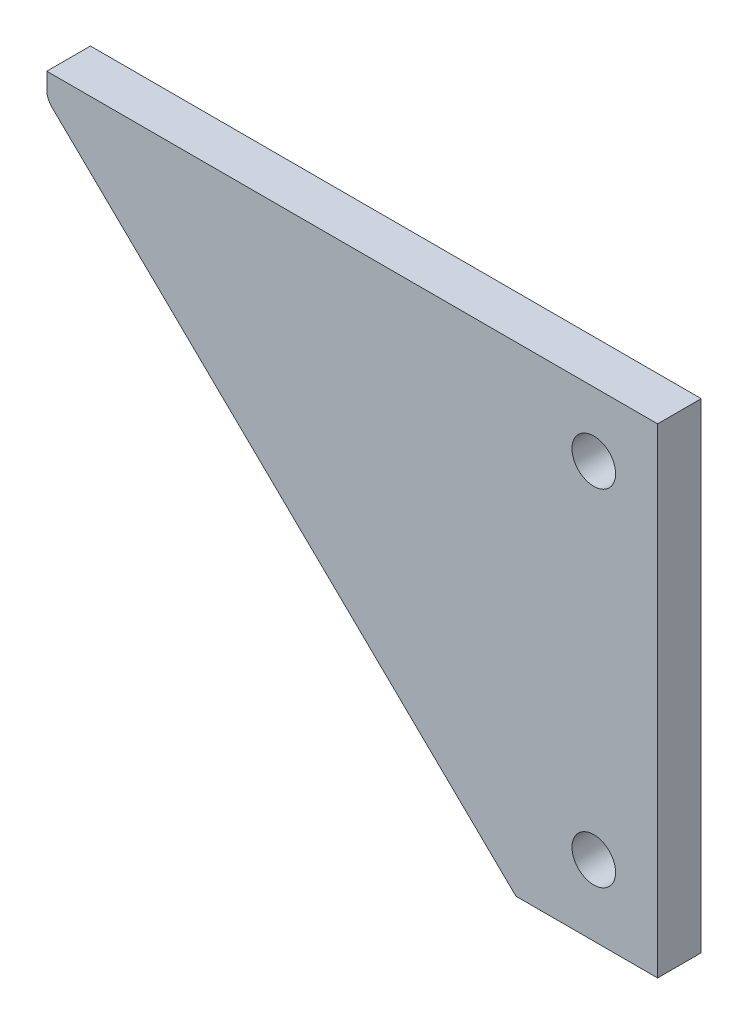
ISO-10303-21;
HEADER;
FILE_DESCRIPTION(('STEP AP214'),'2;1');
FILE_NAME('part.step','',(''),(''),'','','');
FILE_SCHEMA(('AUTOMOTIVE_DESIGN { 1 0 10303 214 1 1 1 1 }'));
ENDSEC;
DATA;
#1=APPLICATION_CONTEXT('core data for automotive mechanical design processes');
#2=APPLICATION_PROTOCOL_DEFINITION('international standard','automotive_design',2000,#1);
#3=PRODUCT_CONTEXT('',#1,'mechanical');
#4=PRODUCT('Part','Part','',(#3));
#5=PRODUCT_RELATED_PRODUCT_CATEGORY('part','',(#4));
#6=PRODUCT_DEFINITION_FORMATION('','',#4);
#7=PRODUCT_DEFINITION_CONTEXT('part definition',#1,'design');
#8=PRODUCT_DEFINITION('design','',#6,#7);
#9=PRODUCT_DEFINITION_SHAPE('','',#8);
#10=(LENGTH_UNIT() NAMED_UNIT(*) SI_UNIT(.MILLI.,.METRE.));
#11=(NAMED_UNIT(*) PLANE_ANGLE_UNIT() SI_UNIT($,.RADIAN.));
#12=(NAMED_UNIT(*) SI_UNIT($,.STERADIAN.) SOLID_ANGLE_UNIT());
#13=UNCERTAINTY_MEASURE_WITH_UNIT(LENGTH_MEASURE(1.E-05),#10,'distance_accuracy_value','');
#14=(GEOMETRIC_REPRESENTATION_CONTEXT(3) GLOBAL_UNCERTAINTY_ASSIGNED_CONTEXT((#13)) GLOBAL_UNIT_ASSIGNED_CONTEXT((#10,
#11,#12)) REPRESENTATION_CONTEXT('',''));
#15=CARTESIAN_POINT('',(0.,0.,0.));
#16=DIRECTION('',(0.,0.,1.));
#17=DIRECTION('',(1.,0.,0.));
#18=AXIS2_PLACEMENT_3D('',#15,#16,#17);
#19=CARTESIAN_POINT('',(0.,0.,5.));
#20=DIRECTION('',(0.,0.,-1.));
#21=DIRECTION('',(-1.,0.,0.));
#22=AXIS2_PLACEMENT_3D('',#19,#20,#21);
#23=PLANE('',#22);
#24=DIRECTION('',(0.,-1.,0.));
#25=VECTOR('',#24,1.);
#26=CARTESIAN_POINT('',(-39.7518732378615,24.6899224806202,5.));
#27=LINE('',#26,#25);
#28=CARTESIAN_POINT('',(-39.7518732378615,27.4031007751938,5.));
#29=VERTEX_POINT('',#28);
#30=CARTESIAN_POINT('',(-39.7518732378615,25.5347678527454,5.));
#31=VERTEX_POINT('',#30);
#32=EDGE_CURVE('E103',#29,#31,#27,.T.);
#33=ORIENTED_EDGE('',*,*,#32,.T.);
#34=CARTESIAN_POINT('',(-37.7518732378615,25.5347678527454,5.));
#35=DIRECTION('',(0.,0.,-1.));
#36=DIRECTION('',(-1.,0.,0.));
#37=AXIS2_PLACEMENT_3D('',#34,#35,#36);
#38=CIRCLE('',#37,2.);
#39=CARTESIAN_POINT('',(-39.1461884833396,24.1009320894073,5.));
#40=VERTEX_POINT('',#39);
#41=EDGE_CURVE('E11',#31,#40,#38,.F.);
#42=ORIENTED_EDGE('',*,*,#41,.T.);
#43=DIRECTION('',(0.71691788166908,-0.697157622739018,0.));
#44=VECTOR('',#43,1.);
#45=CARTESIAN_POINT('',(14.0169678873195,-27.5968992248062,5.));
#46=LINE('',#45,#44);
#47=CARTESIAN_POINT('',(14.0169678873195,-27.5968992248062,5.));
#48=VERTEX_POINT('',#47);
#49=EDGE_CURVE('E92',#40,#48,#46,.T.);
#50=ORIENTED_EDGE('',*,*,#49,.T.);
#51=DIRECTION('',(1.,0.,0.));
#52=VECTOR('',#51,1.);
#53=CARTESIAN_POINT('',(30.2481267621385,-27.5968992248062,5.));
#54=LINE('',#53,#52);
#55=CARTESIAN_POINT('',(30.2481267621385,-27.5968992248062,5.));
#56=VERTEX_POINT('',#55);
#57=EDGE_CURVE('E96',#48,#56,#54,.T.);
#58=ORIENTED_EDGE('',*,*,#57,.T.);
#59=DIRECTION('',(0.,1.,0.));
#60=VECTOR('',#59,1.);
#61=CARTESIAN_POINT('',(30.2481267621385,27.4031007751938,5.));
#62=LINE('',#61,#60);
#63=CARTESIAN_POINT('',(30.2481267621385,27.4031007751938,5.));
#64=VERTEX_POINT('',#63);
#65=EDGE_CURVE('E119',#56,#64,#62,.T.);
#66=ORIENTED_EDGE('',*,*,#65,.T.);
#67=DIRECTION('',(-1.,0.,0.));
#68=VECTOR('',#67,1.);
#69=CARTESIAN_POINT('',(-39.7518732378615,27.4031007751938,5.));
#70=LINE('',#69,#68);
#71=EDGE_CURVE('E122',#64,#29,#70,.T.);
#72=ORIENTED_EDGE('',*,*,#71,.T.);
#73=EDGE_LOOP('',(#33,#42,#50,#58,#66,#72));
#74=FACE_BOUND('',#73,.T.);
#75=CARTESIAN_POINT('',(22.9362631835806,20.0452561597916,5.));
#76=DIRECTION('',(0.,0.,1.));
#77=DIRECTION('',(1.,0.,0.));
#78=AXIS2_PLACEMENT_3D('',#75,#76,#77);
#79=CIRCLE('',#78,2.5);
#80=CARTESIAN_POINT('',(25.4362631835806,20.0452561597916,5.));
#81=VERTEX_POINT('',#80);
#82=EDGE_CURVE('E132',#81,#81,#79,.T.);
#83=ORIENTED_EDGE('',*,*,#82,.F.);
#84=EDGE_LOOP('',(#83));
#85=FACE_BOUND('',#84,.T.);
#86=CARTESIAN_POINT('',(22.9362631835806,-19.5196108443949,5.));
#87=DIRECTION('',(0.,0.,1.));
#88=DIRECTION('',(1.,0.,0.));
#89=AXIS2_PLACEMENT_3D('',#86,#87,#88);
#90=CIRCLE('',#89,2.5);
#91=CARTESIAN_POINT('',(25.4362631835806,-19.5196108443949,5.));
#92=VERTEX_POINT('',#91);
#93=EDGE_CURVE('E176',#92,#92,#90,.T.);
#94=ORIENTED_EDGE('',*,*,#93,.F.);
#95=EDGE_LOOP('',(#94));
#96=FACE_BOUND('',#95,.T.);
#97=ADVANCED_FACE('F39',(#74,#85,#96),#23,.F.);
#98=CARTESIAN_POINT('',(0.,0.,0.));
#99=DIRECTION('',(0.,0.,-1.));
#100=DIRECTION('',(-1.,0.,0.));
#101=AXIS2_PLACEMENT_3D('',#98,#99,#100);
#102=PLANE('',#101);
#103=CARTESIAN_POINT('',(22.9362631835806,20.0452561597916,0.));
#104=DIRECTION('',(0.,0.,1.));
#105=DIRECTION('',(1.,0.,0.));
#106=AXIS2_PLACEMENT_3D('',#103,#104,#105);
#107=CIRCLE('',#106,2.5);
#108=CARTESIAN_POINT('',(25.4362631835806,20.0452561597916,0.));
#109=VERTEX_POINT('',#108);
#110=EDGE_CURVE('E172',#109,#109,#107,.T.);
#111=ORIENTED_EDGE('',*,*,#110,.T.);
#112=EDGE_LOOP('',(#111));
#113=FACE_BOUND('',#112,.T.);
#114=DIRECTION('',(0.71691788166908,-0.697157622739018,0.));
#115=VECTOR('',#114,1.);
#116=CARTESIAN_POINT('',(14.0169678873195,-27.5968992248062,0.));
#117=LINE('',#116,#115);
#118=CARTESIAN_POINT('',(-39.1461884833396,24.1009320894073,0.));
#119=VERTEX_POINT('',#118);
#120=CARTESIAN_POINT('',(14.0169678873195,-27.5968992248062,0.));
#121=VERTEX_POINT('',#120);
#122=EDGE_CURVE('E108',#119,#121,#117,.T.);
#123=ORIENTED_EDGE('',*,*,#122,.F.);
#124=CARTESIAN_POINT('',(-37.7518732378615,25.5347678527454,0.));
#125=DIRECTION('',(0.,0.,-1.));
#126=DIRECTION('',(-1.,0.,0.));
#127=AXIS2_PLACEMENT_3D('',#124,#125,#126);
#128=CIRCLE('',#127,2.);
#129=CARTESIAN_POINT('',(-39.7518732378615,25.5347678527454,0.));
#130=VERTEX_POINT('',#129);
#131=EDGE_CURVE('E62',#119,#130,#128,.T.);
#132=ORIENTED_EDGE('',*,*,#131,.T.);
#133=DIRECTION('',(0.,-1.,0.));
#134=VECTOR('',#133,1.);
#135=CARTESIAN_POINT('',(-39.7518732378615,24.6899224806202,0.));
#136=LINE('',#135,#134);
#137=CARTESIAN_POINT('',(-39.7518732378615,27.4031007751938,0.));
#138=VERTEX_POINT('',#137);
#139=EDGE_CURVE('E129',#138,#130,#136,.T.);
#140=ORIENTED_EDGE('',*,*,#139,.F.);
#141=DIRECTION('',(-1.,0.,0.));
#142=VECTOR('',#141,1.);
#143=CARTESIAN_POINT('',(-39.7518732378615,27.4031007751938,0.));
#144=LINE('',#143,#142);
#145=CARTESIAN_POINT('',(30.2481267621385,27.4031007751938,0.));
#146=VERTEX_POINT('',#145);
#147=EDGE_CURVE('E141',#146,#138,#144,.T.);
#148=ORIENTED_EDGE('',*,*,#147,.F.);
#149=DIRECTION('',(0.,1.,0.));
#150=VECTOR('',#149,1.);
#151=CARTESIAN_POINT('',(30.2481267621385,27.4031007751938,0.));
#152=LINE('',#151,#150);
#153=CARTESIAN_POINT('',(30.2481267621385,-27.5968992248062,0.));
#154=VERTEX_POINT('',#153);
#155=EDGE_CURVE('E138',#154,#146,#152,.T.);
#156=ORIENTED_EDGE('',*,*,#155,.F.);
#157=DIRECTION('',(1.,0.,0.));
#158=VECTOR('',#157,1.);
#159=CARTESIAN_POINT('',(30.2481267621385,-27.5968992248062,0.));
#160=LINE('',#159,#158);
#161=EDGE_CURVE('E135',#121,#154,#160,.T.);
#162=ORIENTED_EDGE('',*,*,#161,.F.);
#163=EDGE_LOOP('',(#123,#132,#140,#148,#156,#162));
#164=FACE_BOUND('',#163,.T.);
#165=CARTESIAN_POINT('',(22.9362631835806,-19.5196108443949,0.));
#166=DIRECTION('',(0.,0.,1.));
#167=DIRECTION('',(1.,0.,0.));
#168=AXIS2_PLACEMENT_3D('',#165,#166,#167);
#169=CIRCLE('',#168,2.5);
#170=CARTESIAN_POINT('',(25.4362631835806,-19.5196108443949,0.));
#171=VERTEX_POINT('',#170);
#172=EDGE_CURVE('E180',#171,#171,#169,.T.);
#173=ORIENTED_EDGE('',*,*,#172,.T.);
#174=EDGE_LOOP('',(#173));
#175=FACE_BOUND('',#174,.T.);
#176=ADVANCED_FACE('F158',(#113,#164,#175),#102,.T.);
#177=CARTESIAN_POINT('',(-39.7518732378615,24.6899224806202,5.));
#178=DIRECTION('',(1.,0.,0.));
#179=DIRECTION('',(0.,0.,-1.));
#180=AXIS2_PLACEMENT_3D('',#177,#178,#179);
#181=PLANE('',#180);
#182=ORIENTED_EDGE('',*,*,#139,.T.);
#183=DIRECTION('',(0.,0.,-1.));
#184=VECTOR('',#183,1.);
#185=CARTESIAN_POINT('',(-39.7518732378615,25.5347678527454,5.));
#186=LINE('',#185,#184);
#187=EDGE_CURVE('E48',#130,#31,#186,.F.);
#188=ORIENTED_EDGE('',*,*,#187,.T.);
#189=ORIENTED_EDGE('',*,*,#32,.F.);
#190=DIRECTION('',(0.,0.,-1.));
#191=VECTOR('',#190,1.);
#192=CARTESIAN_POINT('',(-39.7518732378615,27.4031007751938,5.));
#193=LINE('',#192,#191);
#194=EDGE_CURVE('E128',#29,#138,#193,.T.);
#195=ORIENTED_EDGE('',*,*,#194,.T.);
#196=EDGE_LOOP('',(#182,#188,#189,#195));
#197=FACE_BOUND('',#196,.T.);
#198=ADVANCED_FACE('F169',(#197),#181,.F.);
#199=CARTESIAN_POINT('',(14.0169678873195,-27.5968992248062,5.));
#200=DIRECTION('',(0.697157622739018,0.71691788166908,0.));
#201=DIRECTION('',(-0.71691788166908,0.697157622739018,0.));
#202=AXIS2_PLACEMENT_3D('',#199,#200,#201);
#203=PLANE('',#202);
#204=ORIENTED_EDGE('',*,*,#49,.F.);
#205=DIRECTION('',(0.,0.,-1.));
#206=VECTOR('',#205,1.);
#207=CARTESIAN_POINT('',(-39.1461884833396,24.1009320894073,5.));
#208=LINE('',#207,#206);
#209=EDGE_CURVE('E112',#40,#119,#208,.T.);
#210=ORIENTED_EDGE('',*,*,#209,.T.);
#211=ORIENTED_EDGE('',*,*,#122,.T.);
#212=DIRECTION('',(0.,0.,-1.));
#213=VECTOR('',#212,1.);
#214=CARTESIAN_POINT('',(14.0169678873195,-27.5968992248062,5.));
#215=LINE('',#214,#213);
#216=EDGE_CURVE('E106',#48,#121,#215,.T.);
#217=ORIENTED_EDGE('',*,*,#216,.F.);
#218=EDGE_LOOP('',(#204,#210,#211,#217));
#219=FACE_BOUND('',#218,.T.);
#220=ADVANCED_FACE('F107',(#219),#203,.F.);
#221=CARTESIAN_POINT('',(30.2481267621385,-27.5968992248062,5.));
#222=DIRECTION('',(0.,1.,0.));
#223=DIRECTION('',(-1.,0.,0.));
#224=AXIS2_PLACEMENT_3D('',#221,#222,#223);
#225=PLANE('',#224);
#226=ORIENTED_EDGE('',*,*,#161,.T.);
#227=DIRECTION('',(0.,0.,-1.));
#228=VECTOR('',#227,1.);
#229=CARTESIAN_POINT('',(30.2481267621385,-27.5968992248062,5.));
#230=LINE('',#229,#228);
#231=EDGE_CURVE('E113',#56,#154,#230,.T.);
#232=ORIENTED_EDGE('',*,*,#231,.F.);
#233=ORIENTED_EDGE('',*,*,#57,.F.);
#234=ORIENTED_EDGE('',*,*,#216,.T.);
#235=EDGE_LOOP('',(#226,#232,#233,#234));
#236=FACE_BOUND('',#235,.T.);
#237=ADVANCED_FACE('F115',(#236),#225,.F.);
#238=CARTESIAN_POINT('',(30.2481267621385,27.4031007751938,5.));
#239=DIRECTION('',(-1.,0.,0.));
#240=DIRECTION('',(0.,-1.,0.));
#241=AXIS2_PLACEMENT_3D('',#238,#239,#240);
#242=PLANE('',#241);
#243=ORIENTED_EDGE('',*,*,#155,.T.);
#244=DIRECTION('',(0.,0.,-1.));
#245=VECTOR('',#244,1.);
#246=CARTESIAN_POINT('',(30.2481267621385,27.4031007751938,5.));
#247=LINE('',#246,#245);
#248=EDGE_CURVE('E147',#64,#146,#247,.T.);
#249=ORIENTED_EDGE('',*,*,#248,.F.);
#250=ORIENTED_EDGE('',*,*,#65,.F.);
#251=ORIENTED_EDGE('',*,*,#231,.T.);
#252=EDGE_LOOP('',(#243,#249,#250,#251));
#253=FACE_BOUND('',#252,.T.);
#254=ADVANCED_FACE('F163',(#253),#242,.F.);
#255=CARTESIAN_POINT('',(-39.7518732378615,27.4031007751938,5.));
#256=DIRECTION('',(0.,-1.,0.));
#257=DIRECTION('',(0.,0.,-1.));
#258=AXIS2_PLACEMENT_3D('',#255,#256,#257);
#259=PLANE('',#258);
#260=ORIENTED_EDGE('',*,*,#147,.T.);
#261=ORIENTED_EDGE('',*,*,#194,.F.);
#262=ORIENTED_EDGE('',*,*,#71,.F.);
#263=ORIENTED_EDGE('',*,*,#248,.T.);
#264=EDGE_LOOP('',(#260,#261,#262,#263));
#265=FACE_BOUND('',#264,.T.);
#266=ADVANCED_FACE('F168',(#265),#259,.F.);
#267=CARTESIAN_POINT('',(22.9362631835806,20.0452561597916,5.));
#268=DIRECTION('',(0.,0.,-1.));
#269=DIRECTION('',(-1.,0.,0.));
#270=AXIS2_PLACEMENT_3D('',#267,#268,#269);
#271=CYLINDRICAL_SURFACE('',#270,2.5);
#272=ORIENTED_EDGE('',*,*,#82,.T.);
#273=EDGE_LOOP('',(#272));
#274=FACE_BOUND('',#273,.T.);
#275=ORIENTED_EDGE('',*,*,#110,.F.);
#276=EDGE_LOOP('',(#275));
#277=FACE_BOUND('',#276,.T.);
#278=ADVANCED_FACE('F199',(#274,#277),#271,.F.);
#279=CARTESIAN_POINT('',(22.9362631835806,-19.5196108443949,5.));
#280=DIRECTION('',(0.,0.,-1.));
#281=DIRECTION('',(-1.,0.,0.));
#282=AXIS2_PLACEMENT_3D('',#279,#280,#281);
#283=CYLINDRICAL_SURFACE('',#282,2.5);
#284=ORIENTED_EDGE('',*,*,#93,.T.);
#285=EDGE_LOOP('',(#284));
#286=FACE_BOUND('',#285,.T.);
#287=ORIENTED_EDGE('',*,*,#172,.F.);
#288=EDGE_LOOP('',(#287));
#289=FACE_BOUND('',#288,.T.);
#290=ADVANCED_FACE('F188',(#286,#289),#283,.F.);
#291=CARTESIAN_POINT('',(-37.7518732378615,25.5347678527454,5.));
#292=DIRECTION('',(0.,0.,-1.));
#293=DIRECTION('',(-1.,0.,0.));
#294=AXIS2_PLACEMENT_3D('',#291,#292,#293);
#295=CYLINDRICAL_SURFACE('',#294,2.);
#296=ORIENTED_EDGE('',*,*,#41,.F.);
#297=ORIENTED_EDGE('',*,*,#187,.F.);
#298=ORIENTED_EDGE('',*,*,#131,.F.);
#299=ORIENTED_EDGE('',*,*,#209,.F.);
#300=EDGE_LOOP('',(#296,#297,#298,#299));
#301=FACE_BOUND('',#300,.T.);
#302=ADVANCED_FACE('F41',(#301),#295,.T.);
#303=CLOSED_SHELL('',(#97,#176,#198,#220,#237,#254,#266,#278,#290,#302));
#304=MANIFOLD_SOLID_BREP('B2',#303);
#305=ADVANCED_BREP_SHAPE_REPRESENTATION('',(#18,#304),#14);
#306=SHAPE_DEFINITION_REPRESENTATION(#9,#305);
ENDSEC;
END-ISO-10303-21;
